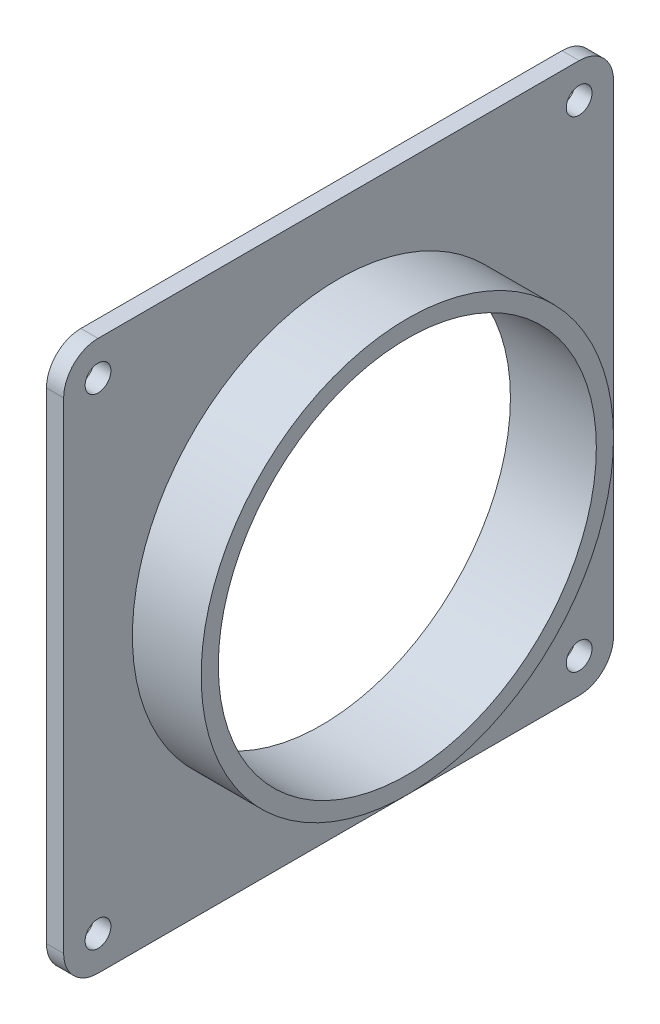
ISO-10303-21;
HEADER;
FILE_DESCRIPTION(('STEP AP214'),'2;1');
FILE_NAME('part.step','',(''),(''),'','','');
FILE_SCHEMA(('AUTOMOTIVE_DESIGN { 1 0 10303 214 1 1 1 1 }'));
ENDSEC;
DATA;
#1=APPLICATION_CONTEXT('core data for automotive mechanical design processes');
#2=APPLICATION_PROTOCOL_DEFINITION('international standard','automotive_design',2000,#1);
#3=PRODUCT_CONTEXT('',#1,'mechanical');
#4=PRODUCT('Part','Part','',(#3));
#5=PRODUCT_RELATED_PRODUCT_CATEGORY('part','',(#4));
#6=PRODUCT_DEFINITION_FORMATION('','',#4);
#7=PRODUCT_DEFINITION_CONTEXT('part definition',#1,'design');
#8=PRODUCT_DEFINITION('design','',#6,#7);
#9=PRODUCT_DEFINITION_SHAPE('','',#8);
#10=(LENGTH_UNIT() NAMED_UNIT(*) SI_UNIT(.MILLI.,.METRE.));
#11=(NAMED_UNIT(*) PLANE_ANGLE_UNIT() SI_UNIT($,.RADIAN.));
#12=(NAMED_UNIT(*) SI_UNIT($,.STERADIAN.) SOLID_ANGLE_UNIT());
#13=UNCERTAINTY_MEASURE_WITH_UNIT(LENGTH_MEASURE(1.E-05),#10,'distance_accuracy_value','');
#14=(GEOMETRIC_REPRESENTATION_CONTEXT(3) GLOBAL_UNCERTAINTY_ASSIGNED_CONTEXT((#13)) GLOBAL_UNIT_ASSIGNED_CONTEXT((#10,
#11,#12)) REPRESENTATION_CONTEXT('',''));
#15=CARTESIAN_POINT('',(0.,0.,0.));
#16=DIRECTION('',(0.,0.,1.));
#17=DIRECTION('',(1.,0.,0.));
#18=AXIS2_PLACEMENT_3D('',#15,#16,#17);
#19=CARTESIAN_POINT('',(3.175,0.,0.));
#20=DIRECTION('',(1.,0.,0.));
#21=DIRECTION('',(0.,0.,-1.));
#22=AXIS2_PLACEMENT_3D('',#19,#20,#21);
#23=CYLINDRICAL_SURFACE('',#22,38.1);
#24=CARTESIAN_POINT('',(15.875,0.,0.));
#25=DIRECTION('',(1.,0.,0.));
#26=DIRECTION('',(0.,0.,-1.));
#27=AXIS2_PLACEMENT_3D('',#24,#25,#26);
#28=CIRCLE('',#27,38.1);
#29=CARTESIAN_POINT('',(15.875,0.,-38.1));
#30=VERTEX_POINT('',#29);
#31=EDGE_CURVE('E98',#30,#30,#28,.T.);
#32=ORIENTED_EDGE('',*,*,#31,.F.);
#33=EDGE_LOOP('',(#32));
#34=FACE_BOUND('',#33,.T.);
#35=CARTESIAN_POINT('',(3.175,0.,0.));
#36=DIRECTION('',(1.,0.,0.));
#37=DIRECTION('',(0.,0.,-1.));
#38=AXIS2_PLACEMENT_3D('',#35,#36,#37);
#39=CIRCLE('',#38,38.1);
#40=CARTESIAN_POINT('',(3.175,0.,-38.1));
#41=VERTEX_POINT('',#40);
#42=EDGE_CURVE('E19',#41,#41,#39,.F.);
#43=ORIENTED_EDGE('',*,*,#42,.F.);
#44=EDGE_LOOP('',(#43));
#45=FACE_BOUND('',#44,.T.);
#46=ADVANCED_FACE('F16',(#34,#45),#23,.T.);
#47=CARTESIAN_POINT('',(3.175,0.,0.));
#48=DIRECTION('',(1.,0.,0.));
#49=DIRECTION('',(0.,0.,-1.));
#50=AXIS2_PLACEMENT_3D('',#47,#48,#49);
#51=PLANE('',#50);
#52=CARTESIAN_POINT('',(3.175,44.45,-44.45));
#53=DIRECTION('',(1.,0.,0.));
#54=DIRECTION('',(0.,0.,-1.));
#55=AXIS2_PLACEMENT_3D('',#52,#53,#54);
#56=CIRCLE('',#55,2.38125);
#57=CARTESIAN_POINT('',(3.175,44.45,-46.83125));
#58=VERTEX_POINT('',#57);
#59=EDGE_CURVE('E155',#58,#58,#56,.F.);
#60=ORIENTED_EDGE('',*,*,#59,.T.);
#61=EDGE_LOOP('',(#60));
#62=FACE_BOUND('',#61,.T.);
#63=ORIENTED_EDGE('',*,*,#42,.T.);
#64=EDGE_LOOP('',(#63));
#65=FACE_BOUND('',#64,.T.);
#66=CARTESIAN_POINT('',(3.175,44.45,44.45));
#67=DIRECTION('',(1.,0.,0.));
#68=DIRECTION('',(0.,0.,-1.));
#69=AXIS2_PLACEMENT_3D('',#66,#67,#68);
#70=CIRCLE('',#69,2.38125);
#71=CARTESIAN_POINT('',(3.175,44.45,42.06875));
#72=VERTEX_POINT('',#71);
#73=EDGE_CURVE('E146',#72,#72,#70,.F.);
#74=ORIENTED_EDGE('',*,*,#73,.T.);
#75=EDGE_LOOP('',(#74));
#76=FACE_BOUND('',#75,.T.);
#77=CARTESIAN_POINT('',(3.175,-44.45,44.45));
#78=DIRECTION('',(1.,0.,0.));
#79=DIRECTION('',(0.,0.,-1.));
#80=AXIS2_PLACEMENT_3D('',#77,#78,#79);
#81=CIRCLE('',#80,2.38125);
#82=CARTESIAN_POINT('',(3.175,-44.45,42.06875));
#83=VERTEX_POINT('',#82);
#84=EDGE_CURVE('E149',#83,#83,#81,.F.);
#85=ORIENTED_EDGE('',*,*,#84,.T.);
#86=EDGE_LOOP('',(#85));
#87=FACE_BOUND('',#86,.T.);
#88=CARTESIAN_POINT('',(3.175,-44.45,-44.45));
#89=DIRECTION('',(1.,0.,0.));
#90=DIRECTION('',(0.,0.,-1.));
#91=AXIS2_PLACEMENT_3D('',#88,#89,#90);
#92=CIRCLE('',#91,2.38125);
#93=CARTESIAN_POINT('',(3.175,-44.45,-46.83125));
#94=VERTEX_POINT('',#93);
#95=EDGE_CURVE('E152',#94,#94,#92,.F.);
#96=ORIENTED_EDGE('',*,*,#95,.T.);
#97=EDGE_LOOP('',(#96));
#98=FACE_BOUND('',#97,.T.);
#99=DIRECTION('',(0.,0.,-1.));
#100=VECTOR('',#99,1.);
#101=CARTESIAN_POINT('',(3.175,-50.8,50.8));
#102=LINE('',#101,#100);
#103=CARTESIAN_POINT('',(3.175,-50.8,-44.45));
#104=VERTEX_POINT('',#103);
#105=CARTESIAN_POINT('',(3.175,-50.8,44.45));
#106=VERTEX_POINT('',#105);
#107=EDGE_CURVE('E94',#104,#106,#102,.F.);
#108=ORIENTED_EDGE('',*,*,#107,.F.);
#109=CARTESIAN_POINT('',(3.175,-44.45,-44.45));
#110=DIRECTION('',(-1.,0.,0.));
#111=DIRECTION('',(0.,0.,1.));
#112=AXIS2_PLACEMENT_3D('',#109,#110,#111);
#113=CIRCLE('',#112,6.35);
#114=CARTESIAN_POINT('',(3.175,-44.45,-50.8));
#115=VERTEX_POINT('',#114);
#116=EDGE_CURVE('E88',#115,#104,#113,.T.);
#117=ORIENTED_EDGE('',*,*,#116,.F.);
#118=DIRECTION('',(0.,1.,0.));
#119=VECTOR('',#118,1.);
#120=CARTESIAN_POINT('',(3.175,-50.8,-50.8));
#121=LINE('',#120,#119);
#122=CARTESIAN_POINT('',(3.175,44.45,-50.8));
#123=VERTEX_POINT('',#122);
#124=EDGE_CURVE('E78',#123,#115,#121,.F.);
#125=ORIENTED_EDGE('',*,*,#124,.F.);
#126=CARTESIAN_POINT('',(3.175,44.45,-44.45));
#127=DIRECTION('',(-1.,0.,0.));
#128=DIRECTION('',(0.,0.,1.));
#129=AXIS2_PLACEMENT_3D('',#126,#127,#128);
#130=CIRCLE('',#129,6.35);
#131=CARTESIAN_POINT('',(3.175,50.8,-44.45));
#132=VERTEX_POINT('',#131);
#133=EDGE_CURVE('E103',#132,#123,#130,.T.);
#134=ORIENTED_EDGE('',*,*,#133,.F.);
#135=DIRECTION('',(0.,0.,1.));
#136=VECTOR('',#135,1.);
#137=CARTESIAN_POINT('',(3.175,50.8,-50.8));
#138=LINE('',#137,#136);
#139=CARTESIAN_POINT('',(3.175,50.8,44.45));
#140=VERTEX_POINT('',#139);
#141=EDGE_CURVE('E115',#140,#132,#138,.F.);
#142=ORIENTED_EDGE('',*,*,#141,.F.);
#143=CARTESIAN_POINT('',(3.175,44.45,44.45));
#144=DIRECTION('',(-1.,0.,0.));
#145=DIRECTION('',(0.,0.,1.));
#146=AXIS2_PLACEMENT_3D('',#143,#144,#145);
#147=CIRCLE('',#146,6.35);
#148=CARTESIAN_POINT('',(3.175,44.45,50.8));
#149=VERTEX_POINT('',#148);
#150=EDGE_CURVE('E161',#149,#140,#147,.T.);
#151=ORIENTED_EDGE('',*,*,#150,.F.);
#152=DIRECTION('',(0.,1.,0.));
#153=VECTOR('',#152,1.);
#154=CARTESIAN_POINT('',(3.175,50.8,50.8));
#155=LINE('',#154,#153);
#156=CARTESIAN_POINT('',(3.175,-44.45,50.8));
#157=VERTEX_POINT('',#156);
#158=EDGE_CURVE('E111',#157,#149,#155,.T.);
#159=ORIENTED_EDGE('',*,*,#158,.F.);
#160=CARTESIAN_POINT('',(3.175,-44.45,44.45));
#161=DIRECTION('',(-1.,0.,0.));
#162=DIRECTION('',(0.,0.,1.));
#163=AXIS2_PLACEMENT_3D('',#160,#161,#162);
#164=CIRCLE('',#163,6.35);
#165=EDGE_CURVE('E159',#106,#157,#164,.T.);
#166=ORIENTED_EDGE('',*,*,#165,.F.);
#167=EDGE_LOOP('',(#108,#117,#125,#134,#142,#151,#159,#166));
#168=FACE_BOUND('',#167,.T.);
#169=ADVANCED_FACE('F92',(#62,#65,#76,#87,#98,#168),#51,.T.);
#170=CARTESIAN_POINT('',(15.875,0.,0.));
#171=DIRECTION('',(1.,0.,0.));
#172=DIRECTION('',(0.,0.,-1.));
#173=AXIS2_PLACEMENT_3D('',#170,#171,#172);
#174=PLANE('',#173);
#175=CARTESIAN_POINT('',(15.875,0.,0.));
#176=DIRECTION('',(1.,0.,0.));
#177=DIRECTION('',(0.,0.,-1.));
#178=AXIS2_PLACEMENT_3D('',#175,#176,#177);
#179=CIRCLE('',#178,34.925);
#180=CARTESIAN_POINT('',(15.875,0.,-34.925));
#181=VERTEX_POINT('',#180);
#182=EDGE_CURVE('E143',#181,#181,#179,.F.);
#183=ORIENTED_EDGE('',*,*,#182,.T.);
#184=EDGE_LOOP('',(#183));
#185=FACE_BOUND('',#184,.T.);
#186=ORIENTED_EDGE('',*,*,#31,.T.);
#187=EDGE_LOOP('',(#186));
#188=FACE_BOUND('',#187,.T.);
#189=ADVANCED_FACE('F176',(#185,#188),#174,.T.);
#190=CARTESIAN_POINT('',(36.56965,-44.45,-44.45));
#191=DIRECTION('',(-1.,0.,0.));
#192=DIRECTION('',(0.,0.,1.));
#193=AXIS2_PLACEMENT_3D('',#190,#191,#192);
#194=CYLINDRICAL_SURFACE('',#193,6.35);
#195=DIRECTION('',(1.,0.,0.));
#196=VECTOR('',#195,1.);
#197=CARTESIAN_POINT('',(0.,-50.8,-44.45));
#198=LINE('',#197,#196);
#199=CARTESIAN_POINT('',(0.,-50.8,-44.45));
#200=VERTEX_POINT('',#199);
#201=EDGE_CURVE('E158',#200,#104,#198,.T.);
#202=ORIENTED_EDGE('',*,*,#201,.F.);
#203=CARTESIAN_POINT('',(0.,-44.45,-44.45));
#204=DIRECTION('',(-1.,0.,0.));
#205=DIRECTION('',(0.,0.,1.));
#206=AXIS2_PLACEMENT_3D('',#203,#204,#205);
#207=CIRCLE('',#206,6.35);
#208=CARTESIAN_POINT('',(0.,-44.45,-50.8));
#209=VERTEX_POINT('',#208);
#210=EDGE_CURVE('E102',#200,#209,#207,.F.);
#211=ORIENTED_EDGE('',*,*,#210,.T.);
#212=DIRECTION('',(-1.,0.,0.));
#213=VECTOR('',#212,1.);
#214=CARTESIAN_POINT('',(0.,-44.45,-50.8));
#215=LINE('',#214,#213);
#216=EDGE_CURVE('E83',#115,#209,#215,.T.);
#217=ORIENTED_EDGE('',*,*,#216,.F.);
#218=ORIENTED_EDGE('',*,*,#116,.T.);
#219=EDGE_LOOP('',(#202,#211,#217,#218));
#220=FACE_BOUND('',#219,.T.);
#221=ADVANCED_FACE('F101',(#220),#194,.T.);
#222=CARTESIAN_POINT('',(0.,-50.8,-50.8));
#223=DIRECTION('',(0.,0.,-1.));
#224=DIRECTION('',(-1.,0.,0.));
#225=AXIS2_PLACEMENT_3D('',#222,#223,#224);
#226=PLANE('',#225);
#227=ORIENTED_EDGE('',*,*,#124,.T.);
#228=ORIENTED_EDGE('',*,*,#216,.T.);
#229=DIRECTION('',(0.,1.,0.));
#230=VECTOR('',#229,1.);
#231=CARTESIAN_POINT('',(0.,0.,-50.8));
#232=LINE('',#231,#230);
#233=CARTESIAN_POINT('',(0.,44.45,-50.8));
#234=VERTEX_POINT('',#233);
#235=EDGE_CURVE('E141',#209,#234,#232,.T.);
#236=ORIENTED_EDGE('',*,*,#235,.T.);
#237=DIRECTION('',(-1.,0.,0.));
#238=VECTOR('',#237,1.);
#239=CARTESIAN_POINT('',(36.56965,44.45,-50.8));
#240=LINE('',#239,#238);
#241=EDGE_CURVE('E85',#123,#234,#240,.T.);
#242=ORIENTED_EDGE('',*,*,#241,.F.);
#243=EDGE_LOOP('',(#227,#228,#236,#242));
#244=FACE_BOUND('',#243,.T.);
#245=ADVANCED_FACE('F80',(#244),#226,.T.);
#246=CARTESIAN_POINT('',(36.56965,44.45,-44.45));
#247=DIRECTION('',(-1.,0.,0.));
#248=DIRECTION('',(0.,0.,1.));
#249=AXIS2_PLACEMENT_3D('',#246,#247,#248);
#250=CYLINDRICAL_SURFACE('',#249,6.35);
#251=ORIENTED_EDGE('',*,*,#241,.T.);
#252=CARTESIAN_POINT('',(0.,44.45,-44.45));
#253=DIRECTION('',(-1.,0.,0.));
#254=DIRECTION('',(0.,0.,1.));
#255=AXIS2_PLACEMENT_3D('',#252,#253,#254);
#256=CIRCLE('',#255,6.35);
#257=CARTESIAN_POINT('',(0.,50.8,-44.45));
#258=VERTEX_POINT('',#257);
#259=EDGE_CURVE('E138',#234,#258,#256,.F.);
#260=ORIENTED_EDGE('',*,*,#259,.T.);
#261=DIRECTION('',(1.,0.,0.));
#262=VECTOR('',#261,1.);
#263=CARTESIAN_POINT('',(0.,50.8,-44.45));
#264=LINE('',#263,#262);
#265=EDGE_CURVE('E116',#132,#258,#264,.F.);
#266=ORIENTED_EDGE('',*,*,#265,.F.);
#267=ORIENTED_EDGE('',*,*,#133,.T.);
#268=EDGE_LOOP('',(#251,#260,#266,#267));
#269=FACE_BOUND('',#268,.T.);
#270=ADVANCED_FACE('F225',(#269),#250,.T.);
#271=CARTESIAN_POINT('',(0.,50.8,-50.8));
#272=DIRECTION('',(0.,1.,0.));
#273=DIRECTION('',(0.,0.,1.));
#274=AXIS2_PLACEMENT_3D('',#271,#272,#273);
#275=PLANE('',#274);
#276=ORIENTED_EDGE('',*,*,#141,.T.);
#277=ORIENTED_EDGE('',*,*,#265,.T.);
#278=DIRECTION('',(0.,0.,-1.));
#279=VECTOR('',#278,1.);
#280=CARTESIAN_POINT('',(0.,50.8,0.));
#281=LINE('',#280,#279);
#282=CARTESIAN_POINT('',(0.,50.8,44.45));
#283=VERTEX_POINT('',#282);
#284=EDGE_CURVE('E137',#258,#283,#281,.F.);
#285=ORIENTED_EDGE('',*,*,#284,.T.);
#286=DIRECTION('',(-1.,0.,0.));
#287=VECTOR('',#286,1.);
#288=CARTESIAN_POINT('',(36.56965,50.8,44.45));
#289=LINE('',#288,#287);
#290=EDGE_CURVE('E114',#140,#283,#289,.T.);
#291=ORIENTED_EDGE('',*,*,#290,.F.);
#292=EDGE_LOOP('',(#276,#277,#285,#291));
#293=FACE_BOUND('',#292,.T.);
#294=ADVANCED_FACE('F221',(#293),#275,.T.);
#295=CARTESIAN_POINT('',(36.56965,44.45,44.45));
#296=DIRECTION('',(-1.,0.,0.));
#297=DIRECTION('',(0.,0.,1.));
#298=AXIS2_PLACEMENT_3D('',#295,#296,#297);
#299=CYLINDRICAL_SURFACE('',#298,6.35);
#300=ORIENTED_EDGE('',*,*,#290,.T.);
#301=CARTESIAN_POINT('',(0.,44.45,44.45));
#302=DIRECTION('',(-1.,0.,0.));
#303=DIRECTION('',(0.,0.,1.));
#304=AXIS2_PLACEMENT_3D('',#301,#302,#303);
#305=CIRCLE('',#304,6.35);
#306=CARTESIAN_POINT('',(0.,44.45,50.8));
#307=VERTEX_POINT('',#306);
#308=EDGE_CURVE('E134',#283,#307,#305,.F.);
#309=ORIENTED_EDGE('',*,*,#308,.T.);
#310=DIRECTION('',(1.,0.,0.));
#311=VECTOR('',#310,1.);
#312=CARTESIAN_POINT('',(0.,44.45,50.8));
#313=LINE('',#312,#311);
#314=EDGE_CURVE('E113',#149,#307,#313,.F.);
#315=ORIENTED_EDGE('',*,*,#314,.F.);
#316=ORIENTED_EDGE('',*,*,#150,.T.);
#317=EDGE_LOOP('',(#300,#309,#315,#316));
#318=FACE_BOUND('',#317,.T.);
#319=ADVANCED_FACE('F217',(#318),#299,.T.);
#320=CARTESIAN_POINT('',(0.,50.8,50.8));
#321=DIRECTION('',(0.,0.,1.));
#322=DIRECTION('',(1.,0.,0.));
#323=AXIS2_PLACEMENT_3D('',#320,#321,#322);
#324=PLANE('',#323);
#325=ORIENTED_EDGE('',*,*,#158,.T.);
#326=ORIENTED_EDGE('',*,*,#314,.T.);
#327=DIRECTION('',(0.,1.,0.));
#328=VECTOR('',#327,1.);
#329=CARTESIAN_POINT('',(0.,0.,50.8));
#330=LINE('',#329,#328);
#331=CARTESIAN_POINT('',(0.,-44.45,50.8));
#332=VERTEX_POINT('',#331);
#333=EDGE_CURVE('E133',#307,#332,#330,.F.);
#334=ORIENTED_EDGE('',*,*,#333,.T.);
#335=DIRECTION('',(-1.,0.,0.));
#336=VECTOR('',#335,1.);
#337=CARTESIAN_POINT('',(36.56965,-44.45,50.8));
#338=LINE('',#337,#336);
#339=EDGE_CURVE('E110',#157,#332,#338,.T.);
#340=ORIENTED_EDGE('',*,*,#339,.F.);
#341=EDGE_LOOP('',(#325,#326,#334,#340));
#342=FACE_BOUND('',#341,.T.);
#343=ADVANCED_FACE('F213',(#342),#324,.T.);
#344=CARTESIAN_POINT('',(36.56965,-44.45,44.45));
#345=DIRECTION('',(-1.,0.,0.));
#346=DIRECTION('',(0.,0.,1.));
#347=AXIS2_PLACEMENT_3D('',#344,#345,#346);
#348=CYLINDRICAL_SURFACE('',#347,6.35);
#349=ORIENTED_EDGE('',*,*,#339,.T.);
#350=CARTESIAN_POINT('',(0.,-44.45,44.45));
#351=DIRECTION('',(-1.,0.,0.));
#352=DIRECTION('',(0.,0.,1.));
#353=AXIS2_PLACEMENT_3D('',#350,#351,#352);
#354=CIRCLE('',#353,6.35);
#355=CARTESIAN_POINT('',(0.,-50.8,44.45));
#356=VERTEX_POINT('',#355);
#357=EDGE_CURVE('E130',#332,#356,#354,.F.);
#358=ORIENTED_EDGE('',*,*,#357,.T.);
#359=DIRECTION('',(1.,0.,0.));
#360=VECTOR('',#359,1.);
#361=CARTESIAN_POINT('',(0.,-50.8,44.45));
#362=LINE('',#361,#360);
#363=EDGE_CURVE('E34',#106,#356,#362,.F.);
#364=ORIENTED_EDGE('',*,*,#363,.F.);
#365=ORIENTED_EDGE('',*,*,#165,.T.);
#366=EDGE_LOOP('',(#349,#358,#364,#365));
#367=FACE_BOUND('',#366,.T.);
#368=ADVANCED_FACE('F210',(#367),#348,.T.);
#369=CARTESIAN_POINT('',(0.,-50.8,50.8));
#370=DIRECTION('',(0.,-1.,0.));
#371=DIRECTION('',(0.,0.,-1.));
#372=AXIS2_PLACEMENT_3D('',#369,#370,#371);
#373=PLANE('',#372);
#374=DIRECTION('',(0.,0.,-1.));
#375=VECTOR('',#374,1.);
#376=CARTESIAN_POINT('',(0.,-50.8,0.));
#377=LINE('',#376,#375);
#378=EDGE_CURVE('E129',#356,#200,#377,.T.);
#379=ORIENTED_EDGE('',*,*,#378,.T.);
#380=ORIENTED_EDGE('',*,*,#201,.T.);
#381=ORIENTED_EDGE('',*,*,#107,.T.);
#382=ORIENTED_EDGE('',*,*,#363,.T.);
#383=EDGE_LOOP('',(#379,#380,#381,#382));
#384=FACE_BOUND('',#383,.T.);
#385=ADVANCED_FACE('F206',(#384),#373,.T.);
#386=CARTESIAN_POINT('',(0.,44.45,-44.45));
#387=DIRECTION('',(1.,0.,0.));
#388=DIRECTION('',(0.,0.,-1.));
#389=AXIS2_PLACEMENT_3D('',#386,#387,#388);
#390=CYLINDRICAL_SURFACE('',#389,2.38125);
#391=ORIENTED_EDGE('',*,*,#59,.F.);
#392=EDGE_LOOP('',(#391));
#393=FACE_BOUND('',#392,.T.);
#394=CARTESIAN_POINT('',(0.,44.45,-44.45));
#395=DIRECTION('',(1.,0.,0.));
#396=DIRECTION('',(0.,0.,-1.));
#397=AXIS2_PLACEMENT_3D('',#394,#395,#396);
#398=CIRCLE('',#397,2.38125);
#399=CARTESIAN_POINT('',(0.,44.45,-46.83125));
#400=VERTEX_POINT('',#399);
#401=EDGE_CURVE('E126',#400,#400,#398,.F.);
#402=ORIENTED_EDGE('',*,*,#401,.T.);
#403=EDGE_LOOP('',(#402));
#404=FACE_BOUND('',#403,.T.);
#405=ADVANCED_FACE('F202',(#393,#404),#390,.F.);
#406=CARTESIAN_POINT('',(0.,-44.45,-44.45));
#407=DIRECTION('',(1.,0.,0.));
#408=DIRECTION('',(0.,0.,-1.));
#409=AXIS2_PLACEMENT_3D('',#406,#407,#408);
#410=CYLINDRICAL_SURFACE('',#409,2.38125);
#411=ORIENTED_EDGE('',*,*,#95,.F.);
#412=EDGE_LOOP('',(#411));
#413=FACE_BOUND('',#412,.T.);
#414=CARTESIAN_POINT('',(0.,-44.45,-44.45));
#415=DIRECTION('',(1.,0.,0.));
#416=DIRECTION('',(0.,0.,-1.));
#417=AXIS2_PLACEMENT_3D('',#414,#415,#416);
#418=CIRCLE('',#417,2.38125);
#419=CARTESIAN_POINT('',(0.,-44.45,-46.83125));
#420=VERTEX_POINT('',#419);
#421=EDGE_CURVE('E123',#420,#420,#418,.F.);
#422=ORIENTED_EDGE('',*,*,#421,.T.);
#423=EDGE_LOOP('',(#422));
#424=FACE_BOUND('',#423,.T.);
#425=ADVANCED_FACE('F198',(#413,#424),#410,.F.);
#426=CARTESIAN_POINT('',(0.,-44.45,44.45));
#427=DIRECTION('',(1.,0.,0.));
#428=DIRECTION('',(0.,0.,-1.));
#429=AXIS2_PLACEMENT_3D('',#426,#427,#428);
#430=CYLINDRICAL_SURFACE('',#429,2.38125);
#431=ORIENTED_EDGE('',*,*,#84,.F.);
#432=EDGE_LOOP('',(#431));
#433=FACE_BOUND('',#432,.T.);
#434=CARTESIAN_POINT('',(0.,-44.45,44.45));
#435=DIRECTION('',(1.,0.,0.));
#436=DIRECTION('',(0.,0.,-1.));
#437=AXIS2_PLACEMENT_3D('',#434,#435,#436);
#438=CIRCLE('',#437,2.38125);
#439=CARTESIAN_POINT('',(0.,-44.45,42.06875));
#440=VERTEX_POINT('',#439);
#441=EDGE_CURVE('E120',#440,#440,#438,.F.);
#442=ORIENTED_EDGE('',*,*,#441,.T.);
#443=EDGE_LOOP('',(#442));
#444=FACE_BOUND('',#443,.T.);
#445=ADVANCED_FACE('F194',(#433,#444),#430,.F.);
#446=CARTESIAN_POINT('',(0.,44.45,44.45));
#447=DIRECTION('',(1.,0.,0.));
#448=DIRECTION('',(0.,0.,-1.));
#449=AXIS2_PLACEMENT_3D('',#446,#447,#448);
#450=CYLINDRICAL_SURFACE('',#449,2.38125);
#451=ORIENTED_EDGE('',*,*,#73,.F.);
#452=EDGE_LOOP('',(#451));
#453=FACE_BOUND('',#452,.T.);
#454=CARTESIAN_POINT('',(0.,44.45,44.45));
#455=DIRECTION('',(1.,0.,0.));
#456=DIRECTION('',(0.,0.,-1.));
#457=AXIS2_PLACEMENT_3D('',#454,#455,#456);
#458=CIRCLE('',#457,2.38125);
#459=CARTESIAN_POINT('',(0.,44.45,42.06875));
#460=VERTEX_POINT('',#459);
#461=EDGE_CURVE('E25',#460,#460,#458,.F.);
#462=ORIENTED_EDGE('',*,*,#461,.T.);
#463=EDGE_LOOP('',(#462));
#464=FACE_BOUND('',#463,.T.);
#465=ADVANCED_FACE('F186',(#453,#464),#450,.F.);
#466=CARTESIAN_POINT('',(0.,0.,0.));
#467=DIRECTION('',(1.,0.,0.));
#468=DIRECTION('',(0.,0.,-1.));
#469=AXIS2_PLACEMENT_3D('',#466,#467,#468);
#470=CYLINDRICAL_SURFACE('',#469,34.925);
#471=ORIENTED_EDGE('',*,*,#182,.F.);
#472=EDGE_LOOP('',(#471));
#473=FACE_BOUND('',#472,.T.);
#474=CARTESIAN_POINT('',(0.,0.,0.));
#475=DIRECTION('',(1.,0.,0.));
#476=DIRECTION('',(0.,0.,-1.));
#477=AXIS2_PLACEMENT_3D('',#474,#475,#476);
#478=CIRCLE('',#477,34.925);
#479=CARTESIAN_POINT('',(0.,0.,-34.925));
#480=VERTEX_POINT('',#479);
#481=EDGE_CURVE('E11',#480,#480,#478,.F.);
#482=ORIENTED_EDGE('',*,*,#481,.T.);
#483=EDGE_LOOP('',(#482));
#484=FACE_BOUND('',#483,.T.);
#485=ADVANCED_FACE('F180',(#473,#484),#470,.F.);
#486=CARTESIAN_POINT('',(0.,0.,0.));
#487=DIRECTION('',(1.,0.,0.));
#488=DIRECTION('',(0.,0.,-1.));
#489=AXIS2_PLACEMENT_3D('',#486,#487,#488);
#490=PLANE('',#489);
#491=ORIENTED_EDGE('',*,*,#481,.F.);
#492=EDGE_LOOP('',(#491));
#493=FACE_BOUND('',#492,.T.);
#494=ORIENTED_EDGE('',*,*,#461,.F.);
#495=EDGE_LOOP('',(#494));
#496=FACE_BOUND('',#495,.T.);
#497=ORIENTED_EDGE('',*,*,#441,.F.);
#498=EDGE_LOOP('',(#497));
#499=FACE_BOUND('',#498,.T.);
#500=ORIENTED_EDGE('',*,*,#421,.F.);
#501=EDGE_LOOP('',(#500));
#502=FACE_BOUND('',#501,.T.);
#503=ORIENTED_EDGE('',*,*,#401,.F.);
#504=EDGE_LOOP('',(#503));
#505=FACE_BOUND('',#504,.T.);
#506=ORIENTED_EDGE('',*,*,#357,.F.);
#507=ORIENTED_EDGE('',*,*,#333,.F.);
#508=ORIENTED_EDGE('',*,*,#308,.F.);
#509=ORIENTED_EDGE('',*,*,#284,.F.);
#510=ORIENTED_EDGE('',*,*,#259,.F.);
#511=ORIENTED_EDGE('',*,*,#235,.F.);
#512=ORIENTED_EDGE('',*,*,#210,.F.);
#513=ORIENTED_EDGE('',*,*,#378,.F.);
#514=EDGE_LOOP('',(#506,#507,#508,#509,#510,#511,#512,#513));
#515=FACE_BOUND('',#514,.T.);
#516=ADVANCED_FACE('F178',(#493,#496,#499,#502,#505,#515),#490,.F.);
#517=CLOSED_SHELL('',(#46,#169,#189,#221,#245,#270,#294,#319,#343,#368,#385,#405,#425,#445,#465,
#485,#516));
#518=MANIFOLD_SOLID_BREP('B1',#517);
#519=ADVANCED_BREP_SHAPE_REPRESENTATION('',(#18,#518),#14);
#520=SHAPE_DEFINITION_REPRESENTATION(#9,#519);
ENDSEC;
END-ISO-10303-21;
